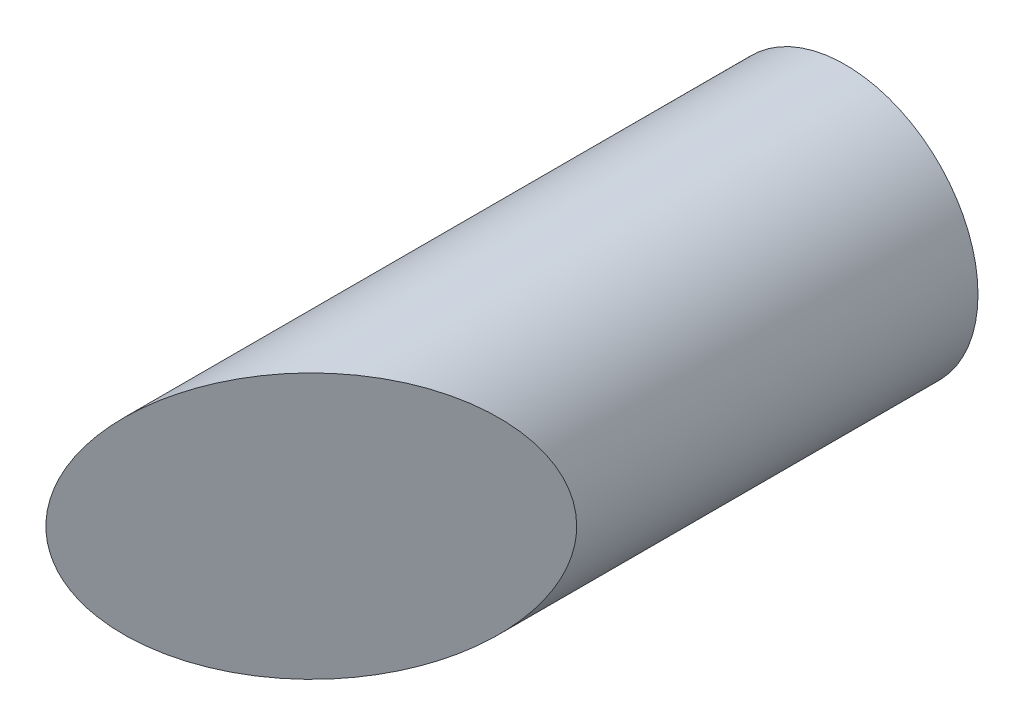
ISO-10303-21;
HEADER;
FILE_DESCRIPTION(('STEP AP214'),'2;1');
FILE_NAME('part.step','',(''),(''),'','','');
FILE_SCHEMA(('AUTOMOTIVE_DESIGN { 1 0 10303 214 1 1 1 1 }'));
ENDSEC;
DATA;
#1=APPLICATION_CONTEXT('core data for automotive mechanical design processes');
#2=APPLICATION_PROTOCOL_DEFINITION('international standard','automotive_design',2000,#1);
#3=PRODUCT_CONTEXT('',#1,'mechanical');
#4=PRODUCT('Part','Part','',(#3));
#5=PRODUCT_RELATED_PRODUCT_CATEGORY('part','',(#4));
#6=PRODUCT_DEFINITION_FORMATION('','',#4);
#7=PRODUCT_DEFINITION_CONTEXT('part definition',#1,'design');
#8=PRODUCT_DEFINITION('design','',#6,#7);
#9=PRODUCT_DEFINITION_SHAPE('','',#8);
#10=(LENGTH_UNIT() NAMED_UNIT(*) SI_UNIT(.MILLI.,.METRE.));
#11=(NAMED_UNIT(*) PLANE_ANGLE_UNIT() SI_UNIT($,.RADIAN.));
#12=(NAMED_UNIT(*) SI_UNIT($,.STERADIAN.) SOLID_ANGLE_UNIT());
#13=UNCERTAINTY_MEASURE_WITH_UNIT(LENGTH_MEASURE(1.E-05),#10,'distance_accuracy_value','');
#14=(GEOMETRIC_REPRESENTATION_CONTEXT(3) GLOBAL_UNCERTAINTY_ASSIGNED_CONTEXT((#13)) GLOBAL_UNIT_ASSIGNED_CONTEXT((#10,
#11,#12)) REPRESENTATION_CONTEXT('',''));
#15=CARTESIAN_POINT('',(0.,0.,0.));
#16=DIRECTION('',(0.,0.,1.));
#17=DIRECTION('',(1.,0.,0.));
#18=AXIS2_PLACEMENT_3D('',#15,#16,#17);
#19=CARTESIAN_POINT('',(0.,0.,23.6166938364139));
#20=DIRECTION('',(0.,0.,-1.));
#21=DIRECTION('',(-1.,0.,0.));
#22=AXIS2_PLACEMENT_3D('',#19,#20,#21);
#23=CYLINDRICAL_SURFACE('',#22,3.175);
#24=CARTESIAN_POINT('',(0.,0.,0.));
#25=DIRECTION('',(0.,0.,1.));
#26=DIRECTION('',(1.,0.,0.));
#27=AXIS2_PLACEMENT_3D('',#24,#25,#26);
#28=CIRCLE('',#27,3.175);
#29=CARTESIAN_POINT('',(3.17500000000001,0.,0.));
#30=VERTEX_POINT('',#29);
#31=EDGE_CURVE('E43',#30,#30,#28,.T.);
#32=ORIENTED_EDGE('',*,*,#31,.T.);
#33=EDGE_LOOP('',(#32));
#34=FACE_BOUND('',#33,.T.);
#35=CARTESIAN_POINT('',(0.,0.,12.7765657758793));
#36=DIRECTION('',(0.707106781186549,0.,0.707106781186546));
#37=DIRECTION('',(0.707106781186546,0.,-0.707106781186549));
#38=AXIS2_PLACEMENT_3D('',#35,#36,#37);
#39=ELLIPSE('',#38,4.49012806053458,3.175);
#40=CARTESIAN_POINT('',(3.17500000000001,0.,9.6015657758793));
#41=VERTEX_POINT('',#40);
#42=EDGE_CURVE('E10',#41,#41,#39,.T.);
#43=ORIENTED_EDGE('',*,*,#42,.F.);
#44=EDGE_LOOP('',(#43));
#45=FACE_BOUND('',#44,.T.);
#46=ADVANCED_FACE('F37',(#34,#45),#23,.T.);
#47=CARTESIAN_POINT('',(0.,0.,0.));
#48=DIRECTION('',(0.,0.,1.));
#49=DIRECTION('',(1.,0.,0.));
#50=AXIS2_PLACEMENT_3D('',#47,#48,#49);
#51=PLANE('',#50);
#52=ORIENTED_EDGE('',*,*,#31,.F.);
#53=EDGE_LOOP('',(#52));
#54=FACE_BOUND('',#53,.T.);
#55=ADVANCED_FACE('F51',(#54),#51,.F.);
#56=CARTESIAN_POINT('',(3.64942841193618,23.0572202538755,9.12713736394313));
#57=DIRECTION('',(0.707106781186549,0.,0.707106781186546));
#58=DIRECTION('',(-0.707106781186546,0.,0.707106781186549));
#59=AXIS2_PLACEMENT_3D('',#56,#57,#58);
#60=PLANE('',#59);
#61=ORIENTED_EDGE('',*,*,#42,.T.);
#62=EDGE_LOOP('',(#61));
#63=FACE_BOUND('',#62,.T.);
#64=ADVANCED_FACE('F53',(#63),#60,.T.);
#65=CLOSED_SHELL('',(#46,#55,#64));
#66=MANIFOLD_SOLID_BREP('B2',#65);
#67=ADVANCED_BREP_SHAPE_REPRESENTATION('',(#18,#66),#14);
#68=SHAPE_DEFINITION_REPRESENTATION(#9,#67);
ENDSEC;
END-ISO-10303-21;
